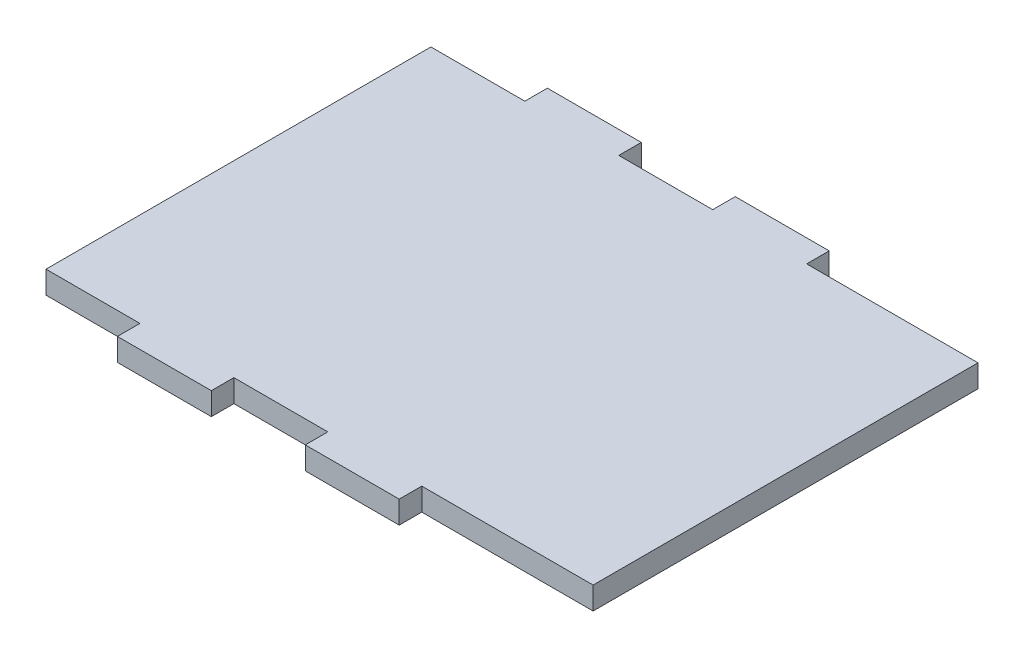
ISO-10303-21;
HEADER;
FILE_DESCRIPTION(('STEP AP214'),'2;1');
FILE_NAME('part.step','',(''),(''),'','','');
FILE_SCHEMA(('AUTOMOTIVE_DESIGN { 1 0 10303 214 1 1 1 1 }'));
ENDSEC;
DATA;
#1=APPLICATION_CONTEXT('core data for automotive mechanical design processes');
#2=APPLICATION_PROTOCOL_DEFINITION('international standard','automotive_design',2000,#1);
#3=PRODUCT_CONTEXT('',#1,'mechanical');
#4=PRODUCT('Part','Part','',(#3));
#5=PRODUCT_RELATED_PRODUCT_CATEGORY('part','',(#4));
#6=PRODUCT_DEFINITION_FORMATION('','',#4);
#7=PRODUCT_DEFINITION_CONTEXT('part definition',#1,'design');
#8=PRODUCT_DEFINITION('design','',#6,#7);
#9=PRODUCT_DEFINITION_SHAPE('','',#8);
#10=(LENGTH_UNIT() NAMED_UNIT(*) SI_UNIT(.MILLI.,.METRE.));
#11=(NAMED_UNIT(*) PLANE_ANGLE_UNIT() SI_UNIT($,.RADIAN.));
#12=(NAMED_UNIT(*) SI_UNIT($,.STERADIAN.) SOLID_ANGLE_UNIT());
#13=UNCERTAINTY_MEASURE_WITH_UNIT(LENGTH_MEASURE(1.E-05),#10,'distance_accuracy_value','');
#14=(GEOMETRIC_REPRESENTATION_CONTEXT(3) GLOBAL_UNCERTAINTY_ASSIGNED_CONTEXT((#13)) GLOBAL_UNIT_ASSIGNED_CONTEXT((#10,
#11,#12)) REPRESENTATION_CONTEXT('',''));
#15=CARTESIAN_POINT('',(0.,0.,0.));
#16=DIRECTION('',(0.,0.,1.));
#17=DIRECTION('',(1.,0.,0.));
#18=AXIS2_PLACEMENT_3D('',#15,#16,#17);
#19=CARTESIAN_POINT('',(-47.8,6.,57.215));
#20=DIRECTION('',(0.,0.,-1.));
#21=DIRECTION('',(-1.,0.,0.));
#22=AXIS2_PLACEMENT_3D('',#19,#20,#21);
#23=PLANE('',#22);
#24=DIRECTION('',(1.,0.,0.));
#25=VECTOR('',#24,1.);
#26=CARTESIAN_POINT('',(-47.8,0.,57.215));
#27=LINE('',#26,#25);
#28=CARTESIAN_POINT('',(-47.8,0.,57.215));
#29=VERTEX_POINT('',#28);
#30=CARTESIAN_POINT('',(-22.8,0.,57.215));
#31=VERTEX_POINT('',#30);
#32=EDGE_CURVE('E203',#29,#31,#27,.T.);
#33=ORIENTED_EDGE('',*,*,#32,.T.);
#34=DIRECTION('',(0.,-1.,0.));
#35=VECTOR('',#34,1.);
#36=CARTESIAN_POINT('',(-22.8,6.,57.215));
#37=LINE('',#36,#35);
#38=CARTESIAN_POINT('',(-22.8,6.,57.215));
#39=VERTEX_POINT('',#38);
#40=EDGE_CURVE('E11',#39,#31,#37,.T.);
#41=ORIENTED_EDGE('',*,*,#40,.F.);
#42=DIRECTION('',(1.,0.,0.));
#43=VECTOR('',#42,1.);
#44=CARTESIAN_POINT('',(-47.8,6.,57.215));
#45=LINE('',#44,#43);
#46=CARTESIAN_POINT('',(-47.8,6.,57.215));
#47=VERTEX_POINT('',#46);
#48=EDGE_CURVE('E241',#47,#39,#45,.T.);
#49=ORIENTED_EDGE('',*,*,#48,.F.);
#50=DIRECTION('',(0.,-1.,0.));
#51=VECTOR('',#50,1.);
#52=CARTESIAN_POINT('',(-47.8,6.,57.215));
#53=LINE('',#52,#51);
#54=EDGE_CURVE('E199',#47,#29,#53,.T.);
#55=ORIENTED_EDGE('',*,*,#54,.T.);
#56=EDGE_LOOP('',(#33,#41,#49,#55));
#57=FACE_BOUND('',#56,.T.);
#58=ADVANCED_FACE('F35',(#57),#23,.F.);
#59=CARTESIAN_POINT('',(-22.8,6.,51.215));
#60=DIRECTION('',(-1.,0.,0.));
#61=DIRECTION('',(0.,0.,1.));
#62=AXIS2_PLACEMENT_3D('',#59,#60,#61);
#63=PLANE('',#62);
#64=DIRECTION('',(0.,0.,-1.));
#65=VECTOR('',#64,1.);
#66=CARTESIAN_POINT('',(-22.8,0.,51.215));
#67=LINE('',#66,#65);
#68=CARTESIAN_POINT('',(-22.8,0.,51.215));
#69=VERTEX_POINT('',#68);
#70=EDGE_CURVE('E206',#31,#69,#67,.T.);
#71=ORIENTED_EDGE('',*,*,#70,.T.);
#72=DIRECTION('',(0.,-1.,0.));
#73=VECTOR('',#72,1.);
#74=CARTESIAN_POINT('',(-22.8,6.,51.215));
#75=LINE('',#74,#73);
#76=CARTESIAN_POINT('',(-22.8,6.,51.215));
#77=VERTEX_POINT('',#76);
#78=EDGE_CURVE('E43',#77,#69,#75,.T.);
#79=ORIENTED_EDGE('',*,*,#78,.F.);
#80=DIRECTION('',(0.,0.,-1.));
#81=VECTOR('',#80,1.);
#82=CARTESIAN_POINT('',(-22.8,6.,51.215));
#83=LINE('',#82,#81);
#84=EDGE_CURVE('E130',#39,#77,#83,.T.);
#85=ORIENTED_EDGE('',*,*,#84,.F.);
#86=ORIENTED_EDGE('',*,*,#40,.T.);
#87=EDGE_LOOP('',(#71,#79,#85,#86));
#88=FACE_BOUND('',#87,.T.);
#89=ADVANCED_FACE('F359',(#88),#63,.F.);
#90=CARTESIAN_POINT('',(2.20000000000001,6.,51.215));
#91=DIRECTION('',(0.,0.,-1.));
#92=DIRECTION('',(-1.,0.,0.));
#93=AXIS2_PLACEMENT_3D('',#90,#91,#92);
#94=PLANE('',#93);
#95=DIRECTION('',(1.,0.,0.));
#96=VECTOR('',#95,1.);
#97=CARTESIAN_POINT('',(2.20000000000001,0.,51.215));
#98=LINE('',#97,#96);
#99=CARTESIAN_POINT('',(2.20000000000001,0.,51.215));
#100=VERTEX_POINT('',#99);
#101=EDGE_CURVE('E208',#69,#100,#98,.T.);
#102=ORIENTED_EDGE('',*,*,#101,.T.);
#103=DIRECTION('',(0.,-1.,0.));
#104=VECTOR('',#103,1.);
#105=CARTESIAN_POINT('',(2.20000000000001,6.,51.215));
#106=LINE('',#105,#104);
#107=CARTESIAN_POINT('',(2.20000000000001,6.,51.215));
#108=VERTEX_POINT('',#107);
#109=EDGE_CURVE('E284',#108,#100,#106,.T.);
#110=ORIENTED_EDGE('',*,*,#109,.F.);
#111=DIRECTION('',(1.,0.,0.));
#112=VECTOR('',#111,1.);
#113=CARTESIAN_POINT('',(2.20000000000001,6.,51.215));
#114=LINE('',#113,#112);
#115=EDGE_CURVE('E292',#77,#108,#114,.T.);
#116=ORIENTED_EDGE('',*,*,#115,.F.);
#117=ORIENTED_EDGE('',*,*,#78,.T.);
#118=EDGE_LOOP('',(#102,#110,#116,#117));
#119=FACE_BOUND('',#118,.T.);
#120=ADVANCED_FACE('F290',(#119),#94,.F.);
#121=CARTESIAN_POINT('',(2.20000000000002,6.,57.215));
#122=DIRECTION('',(1.,0.,0.));
#123=DIRECTION('',(0.,0.,-1.));
#124=AXIS2_PLACEMENT_3D('',#121,#122,#123);
#125=PLANE('',#124);
#126=DIRECTION('',(0.,0.,1.));
#127=VECTOR('',#126,1.);
#128=CARTESIAN_POINT('',(2.20000000000002,0.,57.215));
#129=LINE('',#128,#127);
#130=CARTESIAN_POINT('',(2.20000000000002,0.,57.215));
#131=VERTEX_POINT('',#130);
#132=EDGE_CURVE('E210',#100,#131,#129,.T.);
#133=ORIENTED_EDGE('',*,*,#132,.T.);
#134=DIRECTION('',(0.,-1.,0.));
#135=VECTOR('',#134,1.);
#136=CARTESIAN_POINT('',(2.20000000000002,6.,57.215));
#137=LINE('',#136,#135);
#138=CARTESIAN_POINT('',(2.20000000000002,6.,57.215));
#139=VERTEX_POINT('',#138);
#140=EDGE_CURVE('E281',#139,#131,#137,.T.);
#141=ORIENTED_EDGE('',*,*,#140,.F.);
#142=DIRECTION('',(0.,0.,1.));
#143=VECTOR('',#142,1.);
#144=CARTESIAN_POINT('',(2.20000000000002,6.,57.215));
#145=LINE('',#144,#143);
#146=EDGE_CURVE('E310',#108,#139,#145,.T.);
#147=ORIENTED_EDGE('',*,*,#146,.F.);
#148=ORIENTED_EDGE('',*,*,#109,.T.);
#149=EDGE_LOOP('',(#133,#141,#147,#148));
#150=FACE_BOUND('',#149,.T.);
#151=ADVANCED_FACE('F301',(#150),#125,.F.);
#152=CARTESIAN_POINT('',(2.20000000000002,6.,57.215));
#153=DIRECTION('',(0.,0.,-1.));
#154=DIRECTION('',(-1.,0.,0.));
#155=AXIS2_PLACEMENT_3D('',#152,#153,#154);
#156=PLANE('',#155);
#157=DIRECTION('',(1.,0.,0.));
#158=VECTOR('',#157,1.);
#159=CARTESIAN_POINT('',(2.20000000000002,0.,57.215));
#160=LINE('',#159,#158);
#161=CARTESIAN_POINT('',(27.2,0.,57.215));
#162=VERTEX_POINT('',#161);
#163=EDGE_CURVE('E212',#131,#162,#160,.T.);
#164=ORIENTED_EDGE('',*,*,#163,.T.);
#165=DIRECTION('',(0.,-1.,0.));
#166=VECTOR('',#165,1.);
#167=CARTESIAN_POINT('',(27.2,6.,57.215));
#168=LINE('',#167,#166);
#169=CARTESIAN_POINT('',(27.2,6.,57.215));
#170=VERTEX_POINT('',#169);
#171=EDGE_CURVE('E278',#170,#162,#168,.T.);
#172=ORIENTED_EDGE('',*,*,#171,.F.);
#173=DIRECTION('',(1.,0.,0.));
#174=VECTOR('',#173,1.);
#175=CARTESIAN_POINT('',(2.20000000000002,6.,57.215));
#176=LINE('',#175,#174);
#177=EDGE_CURVE('E307',#139,#170,#176,.T.);
#178=ORIENTED_EDGE('',*,*,#177,.F.);
#179=ORIENTED_EDGE('',*,*,#140,.T.);
#180=EDGE_LOOP('',(#164,#172,#178,#179));
#181=FACE_BOUND('',#180,.T.);
#182=ADVANCED_FACE('F305',(#181),#156,.F.);
#183=CARTESIAN_POINT('',(27.2,6.,57.215));
#184=DIRECTION('',(-1.,0.,0.));
#185=DIRECTION('',(0.,0.,1.));
#186=AXIS2_PLACEMENT_3D('',#183,#184,#185);
#187=PLANE('',#186);
#188=DIRECTION('',(0.,0.,-1.));
#189=VECTOR('',#188,1.);
#190=CARTESIAN_POINT('',(27.2,0.,57.215));
#191=LINE('',#190,#189);
#192=CARTESIAN_POINT('',(27.2,0.,51.215));
#193=VERTEX_POINT('',#192);
#194=EDGE_CURVE('E214',#162,#193,#191,.T.);
#195=ORIENTED_EDGE('',*,*,#194,.T.);
#196=DIRECTION('',(0.,-1.,0.));
#197=VECTOR('',#196,1.);
#198=CARTESIAN_POINT('',(27.2,6.,51.215));
#199=LINE('',#198,#197);
#200=CARTESIAN_POINT('',(27.2,6.,51.215));
#201=VERTEX_POINT('',#200);
#202=EDGE_CURVE('E275',#201,#193,#199,.T.);
#203=ORIENTED_EDGE('',*,*,#202,.F.);
#204=DIRECTION('',(0.,0.,-1.));
#205=VECTOR('',#204,1.);
#206=CARTESIAN_POINT('',(27.2,6.,57.215));
#207=LINE('',#206,#205);
#208=EDGE_CURVE('E309',#170,#201,#207,.T.);
#209=ORIENTED_EDGE('',*,*,#208,.F.);
#210=ORIENTED_EDGE('',*,*,#171,.T.);
#211=EDGE_LOOP('',(#195,#203,#209,#210));
#212=FACE_BOUND('',#211,.T.);
#213=ADVANCED_FACE('F372',(#212),#187,.F.);
#214=CARTESIAN_POINT('',(27.2,6.,51.215));
#215=DIRECTION('',(0.,0.,-1.));
#216=DIRECTION('',(-1.,0.,0.));
#217=AXIS2_PLACEMENT_3D('',#214,#215,#216);
#218=PLANE('',#217);
#219=DIRECTION('',(1.,0.,0.));
#220=VECTOR('',#219,1.);
#221=CARTESIAN_POINT('',(27.2,0.,51.215));
#222=LINE('',#221,#220);
#223=CARTESIAN_POINT('',(72.8,0.,51.215));
#224=VERTEX_POINT('',#223);
#225=EDGE_CURVE('E216',#193,#224,#222,.T.);
#226=ORIENTED_EDGE('',*,*,#225,.T.);
#227=DIRECTION('',(0.,-1.,0.));
#228=VECTOR('',#227,1.);
#229=CARTESIAN_POINT('',(72.8,6.,51.215));
#230=LINE('',#229,#228);
#231=CARTESIAN_POINT('',(72.8,6.,51.215));
#232=VERTEX_POINT('',#231);
#233=EDGE_CURVE('E272',#232,#224,#230,.T.);
#234=ORIENTED_EDGE('',*,*,#233,.F.);
#235=DIRECTION('',(1.,0.,0.));
#236=VECTOR('',#235,1.);
#237=CARTESIAN_POINT('',(27.2,6.,51.215));
#238=LINE('',#237,#236);
#239=EDGE_CURVE('E312',#201,#232,#238,.T.);
#240=ORIENTED_EDGE('',*,*,#239,.F.);
#241=ORIENTED_EDGE('',*,*,#202,.T.);
#242=EDGE_LOOP('',(#226,#234,#240,#241));
#243=FACE_BOUND('',#242,.T.);
#244=ADVANCED_FACE('F375',(#243),#218,.F.);
#245=CARTESIAN_POINT('',(72.8,6.,-51.215));
#246=DIRECTION('',(-1.,0.,0.));
#247=DIRECTION('',(0.,0.,1.));
#248=AXIS2_PLACEMENT_3D('',#245,#246,#247);
#249=PLANE('',#248);
#250=DIRECTION('',(0.,0.,-1.));
#251=VECTOR('',#250,1.);
#252=CARTESIAN_POINT('',(72.8,0.,-51.215));
#253=LINE('',#252,#251);
#254=CARTESIAN_POINT('',(72.8,0.,-51.215));
#255=VERTEX_POINT('',#254);
#256=EDGE_CURVE('E218',#224,#255,#253,.T.);
#257=ORIENTED_EDGE('',*,*,#256,.T.);
#258=DIRECTION('',(0.,-1.,0.));
#259=VECTOR('',#258,1.);
#260=CARTESIAN_POINT('',(72.8,6.,-51.215));
#261=LINE('',#260,#259);
#262=CARTESIAN_POINT('',(72.8,6.,-51.215));
#263=VERTEX_POINT('',#262);
#264=EDGE_CURVE('E269',#263,#255,#261,.T.);
#265=ORIENTED_EDGE('',*,*,#264,.F.);
#266=DIRECTION('',(0.,0.,-1.));
#267=VECTOR('',#266,1.);
#268=CARTESIAN_POINT('',(72.8,6.,-51.215));
#269=LINE('',#268,#267);
#270=EDGE_CURVE('E318',#232,#263,#269,.T.);
#271=ORIENTED_EDGE('',*,*,#270,.F.);
#272=ORIENTED_EDGE('',*,*,#233,.T.);
#273=EDGE_LOOP('',(#257,#265,#271,#272));
#274=FACE_BOUND('',#273,.T.);
#275=ADVANCED_FACE('F379',(#274),#249,.F.);
#276=CARTESIAN_POINT('',(27.2,6.,-51.215));
#277=DIRECTION('',(0.,0.,1.));
#278=DIRECTION('',(1.,0.,0.));
#279=AXIS2_PLACEMENT_3D('',#276,#277,#278);
#280=PLANE('',#279);
#281=DIRECTION('',(-1.,0.,0.));
#282=VECTOR('',#281,1.);
#283=CARTESIAN_POINT('',(27.2,0.,-51.215));
#284=LINE('',#283,#282);
#285=CARTESIAN_POINT('',(27.2,0.,-51.215));
#286=VERTEX_POINT('',#285);
#287=EDGE_CURVE('E220',#255,#286,#284,.T.);
#288=ORIENTED_EDGE('',*,*,#287,.T.);
#289=DIRECTION('',(0.,-1.,0.));
#290=VECTOR('',#289,1.);
#291=CARTESIAN_POINT('',(27.2,6.,-51.215));
#292=LINE('',#291,#290);
#293=CARTESIAN_POINT('',(27.2,6.,-51.215));
#294=VERTEX_POINT('',#293);
#295=EDGE_CURVE('E266',#294,#286,#292,.T.);
#296=ORIENTED_EDGE('',*,*,#295,.F.);
#297=DIRECTION('',(-1.,0.,0.));
#298=VECTOR('',#297,1.);
#299=CARTESIAN_POINT('',(27.2,6.,-51.215));
#300=LINE('',#299,#298);
#301=EDGE_CURVE('E320',#263,#294,#300,.T.);
#302=ORIENTED_EDGE('',*,*,#301,.F.);
#303=ORIENTED_EDGE('',*,*,#264,.T.);
#304=EDGE_LOOP('',(#288,#296,#302,#303));
#305=FACE_BOUND('',#304,.T.);
#306=ADVANCED_FACE('F383',(#305),#280,.F.);
#307=CARTESIAN_POINT('',(27.2,6.,-57.215));
#308=DIRECTION('',(-1.,0.,0.));
#309=DIRECTION('',(0.,0.,1.));
#310=AXIS2_PLACEMENT_3D('',#307,#308,#309);
#311=PLANE('',#310);
#312=DIRECTION('',(0.,0.,-1.));
#313=VECTOR('',#312,1.);
#314=CARTESIAN_POINT('',(27.2,0.,-57.215));
#315=LINE('',#314,#313);
#316=CARTESIAN_POINT('',(27.2,0.,-57.215));
#317=VERTEX_POINT('',#316);
#318=EDGE_CURVE('E222',#286,#317,#315,.T.);
#319=ORIENTED_EDGE('',*,*,#318,.T.);
#320=DIRECTION('',(0.,-1.,0.));
#321=VECTOR('',#320,1.);
#322=CARTESIAN_POINT('',(27.2,6.,-57.215));
#323=LINE('',#322,#321);
#324=CARTESIAN_POINT('',(27.2,6.,-57.215));
#325=VERTEX_POINT('',#324);
#326=EDGE_CURVE('E263',#325,#317,#323,.T.);
#327=ORIENTED_EDGE('',*,*,#326,.F.);
#328=DIRECTION('',(0.,0.,-1.));
#329=VECTOR('',#328,1.);
#330=CARTESIAN_POINT('',(27.2,6.,-57.215));
#331=LINE('',#330,#329);
#332=EDGE_CURVE('E322',#294,#325,#331,.T.);
#333=ORIENTED_EDGE('',*,*,#332,.F.);
#334=ORIENTED_EDGE('',*,*,#295,.T.);
#335=EDGE_LOOP('',(#319,#327,#333,#334));
#336=FACE_BOUND('',#335,.T.);
#337=ADVANCED_FACE('F387',(#336),#311,.F.);
#338=CARTESIAN_POINT('',(2.20000000000002,6.,-57.215));
#339=DIRECTION('',(0.,0.,1.));
#340=DIRECTION('',(1.,0.,0.));
#341=AXIS2_PLACEMENT_3D('',#338,#339,#340);
#342=PLANE('',#341);
#343=DIRECTION('',(-1.,0.,0.));
#344=VECTOR('',#343,1.);
#345=CARTESIAN_POINT('',(2.20000000000002,0.,-57.215));
#346=LINE('',#345,#344);
#347=CARTESIAN_POINT('',(2.20000000000002,0.,-57.215));
#348=VERTEX_POINT('',#347);
#349=EDGE_CURVE('E224',#317,#348,#346,.T.);
#350=ORIENTED_EDGE('',*,*,#349,.T.);
#351=DIRECTION('',(0.,-1.,0.));
#352=VECTOR('',#351,1.);
#353=CARTESIAN_POINT('',(2.20000000000002,6.,-57.215));
#354=LINE('',#353,#352);
#355=CARTESIAN_POINT('',(2.20000000000002,6.,-57.215));
#356=VERTEX_POINT('',#355);
#357=EDGE_CURVE('E260',#356,#348,#354,.T.);
#358=ORIENTED_EDGE('',*,*,#357,.F.);
#359=DIRECTION('',(-1.,0.,0.));
#360=VECTOR('',#359,1.);
#361=CARTESIAN_POINT('',(2.20000000000002,6.,-57.215));
#362=LINE('',#361,#360);
#363=EDGE_CURVE('E324',#325,#356,#362,.T.);
#364=ORIENTED_EDGE('',*,*,#363,.F.);
#365=ORIENTED_EDGE('',*,*,#326,.T.);
#366=EDGE_LOOP('',(#350,#358,#364,#365));
#367=FACE_BOUND('',#366,.T.);
#368=ADVANCED_FACE('F391',(#367),#342,.F.);
#369=CARTESIAN_POINT('',(2.20000000000002,6.,-57.215));
#370=DIRECTION('',(1.,0.,0.));
#371=DIRECTION('',(0.,0.,-1.));
#372=AXIS2_PLACEMENT_3D('',#369,#370,#371);
#373=PLANE('',#372);
#374=DIRECTION('',(0.,0.,1.));
#375=VECTOR('',#374,1.);
#376=CARTESIAN_POINT('',(2.20000000000002,0.,-57.215));
#377=LINE('',#376,#375);
#378=CARTESIAN_POINT('',(2.20000000000002,0.,-51.215));
#379=VERTEX_POINT('',#378);
#380=EDGE_CURVE('E226',#348,#379,#377,.T.);
#381=ORIENTED_EDGE('',*,*,#380,.T.);
#382=DIRECTION('',(0.,-1.,0.));
#383=VECTOR('',#382,1.);
#384=CARTESIAN_POINT('',(2.20000000000002,6.,-51.215));
#385=LINE('',#384,#383);
#386=CARTESIAN_POINT('',(2.20000000000002,6.,-51.215));
#387=VERTEX_POINT('',#386);
#388=EDGE_CURVE('E257',#387,#379,#385,.T.);
#389=ORIENTED_EDGE('',*,*,#388,.F.);
#390=DIRECTION('',(0.,0.,1.));
#391=VECTOR('',#390,1.);
#392=CARTESIAN_POINT('',(2.20000000000002,6.,-57.215));
#393=LINE('',#392,#391);
#394=EDGE_CURVE('E326',#356,#387,#393,.T.);
#395=ORIENTED_EDGE('',*,*,#394,.F.);
#396=ORIENTED_EDGE('',*,*,#357,.T.);
#397=EDGE_LOOP('',(#381,#389,#395,#396));
#398=FACE_BOUND('',#397,.T.);
#399=ADVANCED_FACE('F395',(#398),#373,.F.);
#400=CARTESIAN_POINT('',(-22.8,6.,-51.215));
#401=DIRECTION('',(0.,0.,1.));
#402=DIRECTION('',(1.,0.,0.));
#403=AXIS2_PLACEMENT_3D('',#400,#401,#402);
#404=PLANE('',#403);
#405=DIRECTION('',(-1.,0.,0.));
#406=VECTOR('',#405,1.);
#407=CARTESIAN_POINT('',(-22.8,0.,-51.215));
#408=LINE('',#407,#406);
#409=CARTESIAN_POINT('',(-22.8,0.,-51.215));
#410=VERTEX_POINT('',#409);
#411=EDGE_CURVE('E228',#379,#410,#408,.T.);
#412=ORIENTED_EDGE('',*,*,#411,.T.);
#413=DIRECTION('',(0.,-1.,0.));
#414=VECTOR('',#413,1.);
#415=CARTESIAN_POINT('',(-22.8,6.,-51.215));
#416=LINE('',#415,#414);
#417=CARTESIAN_POINT('',(-22.8,6.,-51.215));
#418=VERTEX_POINT('',#417);
#419=EDGE_CURVE('E254',#418,#410,#416,.T.);
#420=ORIENTED_EDGE('',*,*,#419,.F.);
#421=DIRECTION('',(-1.,0.,0.));
#422=VECTOR('',#421,1.);
#423=CARTESIAN_POINT('',(-22.8,6.,-51.215));
#424=LINE('',#423,#422);
#425=EDGE_CURVE('E328',#387,#418,#424,.T.);
#426=ORIENTED_EDGE('',*,*,#425,.F.);
#427=ORIENTED_EDGE('',*,*,#388,.T.);
#428=EDGE_LOOP('',(#412,#420,#426,#427));
#429=FACE_BOUND('',#428,.T.);
#430=ADVANCED_FACE('F399',(#429),#404,.F.);
#431=CARTESIAN_POINT('',(-22.8,6.,-51.215));
#432=DIRECTION('',(-1.,0.,0.));
#433=DIRECTION('',(0.,0.,1.));
#434=AXIS2_PLACEMENT_3D('',#431,#432,#433);
#435=PLANE('',#434);
#436=DIRECTION('',(0.,0.,-1.));
#437=VECTOR('',#436,1.);
#438=CARTESIAN_POINT('',(-22.8,0.,-51.215));
#439=LINE('',#438,#437);
#440=CARTESIAN_POINT('',(-22.8,0.,-57.215));
#441=VERTEX_POINT('',#440);
#442=EDGE_CURVE('E230',#410,#441,#439,.T.);
#443=ORIENTED_EDGE('',*,*,#442,.T.);
#444=DIRECTION('',(0.,-1.,0.));
#445=VECTOR('',#444,1.);
#446=CARTESIAN_POINT('',(-22.8,6.,-57.215));
#447=LINE('',#446,#445);
#448=CARTESIAN_POINT('',(-22.8,6.,-57.215));
#449=VERTEX_POINT('',#448);
#450=EDGE_CURVE('E251',#449,#441,#447,.T.);
#451=ORIENTED_EDGE('',*,*,#450,.F.);
#452=DIRECTION('',(0.,0.,-1.));
#453=VECTOR('',#452,1.);
#454=CARTESIAN_POINT('',(-22.8,6.,-51.215));
#455=LINE('',#454,#453);
#456=EDGE_CURVE('E330',#418,#449,#455,.T.);
#457=ORIENTED_EDGE('',*,*,#456,.F.);
#458=ORIENTED_EDGE('',*,*,#419,.T.);
#459=EDGE_LOOP('',(#443,#451,#457,#458));
#460=FACE_BOUND('',#459,.T.);
#461=ADVANCED_FACE('F403',(#460),#435,.F.);
#462=CARTESIAN_POINT('',(-47.8,6.,-57.215));
#463=DIRECTION('',(0.,0.,1.));
#464=DIRECTION('',(1.,0.,0.));
#465=AXIS2_PLACEMENT_3D('',#462,#463,#464);
#466=PLANE('',#465);
#467=DIRECTION('',(-1.,0.,0.));
#468=VECTOR('',#467,1.);
#469=CARTESIAN_POINT('',(-47.8,0.,-57.215));
#470=LINE('',#469,#468);
#471=CARTESIAN_POINT('',(-47.8,0.,-57.215));
#472=VERTEX_POINT('',#471);
#473=EDGE_CURVE('E232',#441,#472,#470,.T.);
#474=ORIENTED_EDGE('',*,*,#473,.T.);
#475=DIRECTION('',(0.,-1.,0.));
#476=VECTOR('',#475,1.);
#477=CARTESIAN_POINT('',(-47.8,6.,-57.215));
#478=LINE('',#477,#476);
#479=CARTESIAN_POINT('',(-47.8,6.,-57.215));
#480=VERTEX_POINT('',#479);
#481=EDGE_CURVE('E248',#480,#472,#478,.T.);
#482=ORIENTED_EDGE('',*,*,#481,.F.);
#483=DIRECTION('',(-1.,0.,0.));
#484=VECTOR('',#483,1.);
#485=CARTESIAN_POINT('',(-47.8,6.,-57.215));
#486=LINE('',#485,#484);
#487=EDGE_CURVE('E332',#449,#480,#486,.T.);
#488=ORIENTED_EDGE('',*,*,#487,.F.);
#489=ORIENTED_EDGE('',*,*,#450,.T.);
#490=EDGE_LOOP('',(#474,#482,#488,#489));
#491=FACE_BOUND('',#490,.T.);
#492=ADVANCED_FACE('F407',(#491),#466,.F.);
#493=CARTESIAN_POINT('',(-47.8,6.,-57.215));
#494=DIRECTION('',(1.,0.,0.));
#495=DIRECTION('',(0.,0.,-1.));
#496=AXIS2_PLACEMENT_3D('',#493,#494,#495);
#497=PLANE('',#496);
#498=DIRECTION('',(0.,0.,1.));
#499=VECTOR('',#498,1.);
#500=CARTESIAN_POINT('',(-47.8,0.,-57.215));
#501=LINE('',#500,#499);
#502=CARTESIAN_POINT('',(-47.8,0.,-51.215));
#503=VERTEX_POINT('',#502);
#504=EDGE_CURVE('E234',#472,#503,#501,.T.);
#505=ORIENTED_EDGE('',*,*,#504,.T.);
#506=DIRECTION('',(0.,-1.,0.));
#507=VECTOR('',#506,1.);
#508=CARTESIAN_POINT('',(-47.8,6.,-51.215));
#509=LINE('',#508,#507);
#510=CARTESIAN_POINT('',(-47.8,6.,-51.215));
#511=VERTEX_POINT('',#510);
#512=EDGE_CURVE('E245',#511,#503,#509,.T.);
#513=ORIENTED_EDGE('',*,*,#512,.F.);
#514=DIRECTION('',(0.,0.,1.));
#515=VECTOR('',#514,1.);
#516=CARTESIAN_POINT('',(-47.8,6.,-57.215));
#517=LINE('',#516,#515);
#518=EDGE_CURVE('E334',#480,#511,#517,.T.);
#519=ORIENTED_EDGE('',*,*,#518,.F.);
#520=ORIENTED_EDGE('',*,*,#481,.T.);
#521=EDGE_LOOP('',(#505,#513,#519,#520));
#522=FACE_BOUND('',#521,.T.);
#523=ADVANCED_FACE('F340',(#522),#497,.F.);
#524=CARTESIAN_POINT('',(-47.8,6.,-51.215));
#525=DIRECTION('',(0.,0.,1.));
#526=DIRECTION('',(1.,0.,0.));
#527=AXIS2_PLACEMENT_3D('',#524,#525,#526);
#528=PLANE('',#527);
#529=DIRECTION('',(-1.,0.,0.));
#530=VECTOR('',#529,1.);
#531=CARTESIAN_POINT('',(-47.8,0.,-51.215));
#532=LINE('',#531,#530);
#533=CARTESIAN_POINT('',(-72.8,0.,-51.215));
#534=VERTEX_POINT('',#533);
#535=EDGE_CURVE('E236',#503,#534,#532,.T.);
#536=ORIENTED_EDGE('',*,*,#535,.T.);
#537=DIRECTION('',(0.,-1.,0.));
#538=VECTOR('',#537,1.);
#539=CARTESIAN_POINT('',(-72.8,6.,-51.215));
#540=LINE('',#539,#538);
#541=CARTESIAN_POINT('',(-72.8,6.,-51.215));
#542=VERTEX_POINT('',#541);
#543=EDGE_CURVE('E194',#542,#534,#540,.T.);
#544=ORIENTED_EDGE('',*,*,#543,.F.);
#545=DIRECTION('',(-1.,0.,0.));
#546=VECTOR('',#545,1.);
#547=CARTESIAN_POINT('',(-47.8,6.,-51.215));
#548=LINE('',#547,#546);
#549=EDGE_CURVE('E185',#511,#542,#548,.T.);
#550=ORIENTED_EDGE('',*,*,#549,.F.);
#551=ORIENTED_EDGE('',*,*,#512,.T.);
#552=EDGE_LOOP('',(#536,#544,#550,#551));
#553=FACE_BOUND('',#552,.T.);
#554=ADVANCED_FACE('F344',(#553),#528,.F.);
#555=CARTESIAN_POINT('',(-72.8,6.,-51.215));
#556=DIRECTION('',(1.,0.,0.));
#557=DIRECTION('',(0.,0.,-1.));
#558=AXIS2_PLACEMENT_3D('',#555,#556,#557);
#559=PLANE('',#558);
#560=DIRECTION('',(0.,0.,1.));
#561=VECTOR('',#560,1.);
#562=CARTESIAN_POINT('',(-72.8,0.,-51.215));
#563=LINE('',#562,#561);
#564=CARTESIAN_POINT('',(-72.8,0.,51.215));
#565=VERTEX_POINT('',#564);
#566=EDGE_CURVE('E193',#534,#565,#563,.T.);
#567=ORIENTED_EDGE('',*,*,#566,.T.);
#568=DIRECTION('',(0.,-1.,0.));
#569=VECTOR('',#568,1.);
#570=CARTESIAN_POINT('',(-72.8,6.,51.215));
#571=LINE('',#570,#569);
#572=CARTESIAN_POINT('',(-72.8,6.,51.215));
#573=VERTEX_POINT('',#572);
#574=EDGE_CURVE('E190',#573,#565,#571,.T.);
#575=ORIENTED_EDGE('',*,*,#574,.F.);
#576=DIRECTION('',(0.,0.,1.));
#577=VECTOR('',#576,1.);
#578=CARTESIAN_POINT('',(-72.8,6.,-51.215));
#579=LINE('',#578,#577);
#580=EDGE_CURVE('E179',#542,#573,#579,.T.);
#581=ORIENTED_EDGE('',*,*,#580,.F.);
#582=ORIENTED_EDGE('',*,*,#543,.T.);
#583=EDGE_LOOP('',(#567,#575,#581,#582));
#584=FACE_BOUND('',#583,.T.);
#585=ADVANCED_FACE('F191',(#584),#559,.F.);
#586=CARTESIAN_POINT('',(-47.8,6.,51.215));
#587=DIRECTION('',(0.,0.,-1.));
#588=DIRECTION('',(-1.,0.,0.));
#589=AXIS2_PLACEMENT_3D('',#586,#587,#588);
#590=PLANE('',#589);
#591=DIRECTION('',(1.,0.,0.));
#592=VECTOR('',#591,1.);
#593=CARTESIAN_POINT('',(-47.8,0.,51.215));
#594=LINE('',#593,#592);
#595=CARTESIAN_POINT('',(-47.8,0.,51.215));
#596=VERTEX_POINT('',#595);
#597=EDGE_CURVE('E116',#565,#596,#594,.T.);
#598=ORIENTED_EDGE('',*,*,#597,.T.);
#599=DIRECTION('',(0.,-1.,0.));
#600=VECTOR('',#599,1.);
#601=CARTESIAN_POINT('',(-47.8,6.,51.215));
#602=LINE('',#601,#600);
#603=CARTESIAN_POINT('',(-47.8,6.,51.215));
#604=VERTEX_POINT('',#603);
#605=EDGE_CURVE('E195',#604,#596,#602,.T.);
#606=ORIENTED_EDGE('',*,*,#605,.F.);
#607=DIRECTION('',(1.,0.,0.));
#608=VECTOR('',#607,1.);
#609=CARTESIAN_POINT('',(-47.8,6.,51.215));
#610=LINE('',#609,#608);
#611=EDGE_CURVE('E183',#573,#604,#610,.T.);
#612=ORIENTED_EDGE('',*,*,#611,.F.);
#613=ORIENTED_EDGE('',*,*,#574,.T.);
#614=EDGE_LOOP('',(#598,#606,#612,#613));
#615=FACE_BOUND('',#614,.T.);
#616=ADVANCED_FACE('F197',(#615),#590,.F.);
#617=CARTESIAN_POINT('',(-47.8,6.,57.215));
#618=DIRECTION('',(1.,0.,0.));
#619=DIRECTION('',(0.,0.,-1.));
#620=AXIS2_PLACEMENT_3D('',#617,#618,#619);
#621=PLANE('',#620);
#622=DIRECTION('',(0.,0.,1.));
#623=VECTOR('',#622,1.);
#624=CARTESIAN_POINT('',(-47.8,0.,57.215));
#625=LINE('',#624,#623);
#626=EDGE_CURVE('E122',#596,#29,#625,.T.);
#627=ORIENTED_EDGE('',*,*,#626,.T.);
#628=ORIENTED_EDGE('',*,*,#54,.F.);
#629=DIRECTION('',(0.,0.,1.));
#630=VECTOR('',#629,1.);
#631=CARTESIAN_POINT('',(-47.8,6.,57.215));
#632=LINE('',#631,#630);
#633=EDGE_CURVE('E51',#604,#47,#632,.T.);
#634=ORIENTED_EDGE('',*,*,#633,.F.);
#635=ORIENTED_EDGE('',*,*,#605,.T.);
#636=EDGE_LOOP('',(#627,#628,#634,#635));
#637=FACE_BOUND('',#636,.T.);
#638=ADVANCED_FACE('F348',(#637),#621,.F.);
#639=CARTESIAN_POINT('',(0.,6.,0.));
#640=DIRECTION('',(0.,-1.,0.));
#641=DIRECTION('',(0.,0.,-1.));
#642=AXIS2_PLACEMENT_3D('',#639,#640,#641);
#643=PLANE('',#642);
#644=ORIENTED_EDGE('',*,*,#48,.T.);
#645=ORIENTED_EDGE('',*,*,#84,.T.);
#646=ORIENTED_EDGE('',*,*,#115,.T.);
#647=ORIENTED_EDGE('',*,*,#146,.T.);
#648=ORIENTED_EDGE('',*,*,#177,.T.);
#649=ORIENTED_EDGE('',*,*,#208,.T.);
#650=ORIENTED_EDGE('',*,*,#239,.T.);
#651=ORIENTED_EDGE('',*,*,#270,.T.);
#652=ORIENTED_EDGE('',*,*,#301,.T.);
#653=ORIENTED_EDGE('',*,*,#332,.T.);
#654=ORIENTED_EDGE('',*,*,#363,.T.);
#655=ORIENTED_EDGE('',*,*,#394,.T.);
#656=ORIENTED_EDGE('',*,*,#425,.T.);
#657=ORIENTED_EDGE('',*,*,#456,.T.);
#658=ORIENTED_EDGE('',*,*,#487,.T.);
#659=ORIENTED_EDGE('',*,*,#518,.T.);
#660=ORIENTED_EDGE('',*,*,#549,.T.);
#661=ORIENTED_EDGE('',*,*,#580,.T.);
#662=ORIENTED_EDGE('',*,*,#611,.T.);
#663=ORIENTED_EDGE('',*,*,#633,.T.);
#664=EDGE_LOOP('',(#644,#645,#646,#647,#648,#649,#650,#651,#652,#653,#654,#655,#656,#657,#658,
#659,#660,#661,#662,#663));
#665=FACE_BOUND('',#664,.T.);
#666=ADVANCED_FACE('F181',(#665),#643,.F.);
#667=CARTESIAN_POINT('',(0.,0.,0.));
#668=DIRECTION('',(0.,-1.,0.));
#669=DIRECTION('',(0.,0.,-1.));
#670=AXIS2_PLACEMENT_3D('',#667,#668,#669);
#671=PLANE('',#670);
#672=ORIENTED_EDGE('',*,*,#32,.F.);
#673=ORIENTED_EDGE('',*,*,#626,.F.);
#674=ORIENTED_EDGE('',*,*,#597,.F.);
#675=ORIENTED_EDGE('',*,*,#566,.F.);
#676=ORIENTED_EDGE('',*,*,#535,.F.);
#677=ORIENTED_EDGE('',*,*,#504,.F.);
#678=ORIENTED_EDGE('',*,*,#473,.F.);
#679=ORIENTED_EDGE('',*,*,#442,.F.);
#680=ORIENTED_EDGE('',*,*,#411,.F.);
#681=ORIENTED_EDGE('',*,*,#380,.F.);
#682=ORIENTED_EDGE('',*,*,#349,.F.);
#683=ORIENTED_EDGE('',*,*,#318,.F.);
#684=ORIENTED_EDGE('',*,*,#287,.F.);
#685=ORIENTED_EDGE('',*,*,#256,.F.);
#686=ORIENTED_EDGE('',*,*,#225,.F.);
#687=ORIENTED_EDGE('',*,*,#194,.F.);
#688=ORIENTED_EDGE('',*,*,#163,.F.);
#689=ORIENTED_EDGE('',*,*,#132,.F.);
#690=ORIENTED_EDGE('',*,*,#101,.F.);
#691=ORIENTED_EDGE('',*,*,#70,.F.);
#692=EDGE_LOOP('',(#672,#673,#674,#675,#676,#677,#678,#679,#680,#681,#682,#683,#684,#685,#686,
#687,#688,#689,#690,#691));
#693=FACE_BOUND('',#692,.T.);
#694=ADVANCED_FACE('F296',(#693),#671,.T.);
#695=CLOSED_SHELL('',(#58,#89,#120,#151,#182,#213,#244,#275,#306,#337,#368,#399,#430,#461,#492,
#523,#554,#585,#616,#638,#666,#694));
#696=MANIFOLD_SOLID_BREP('B2',#695);
#697=ADVANCED_BREP_SHAPE_REPRESENTATION('',(#18,#696),#14);
#698=SHAPE_DEFINITION_REPRESENTATION(#9,#697);
ENDSEC;
END-ISO-10303-21;
